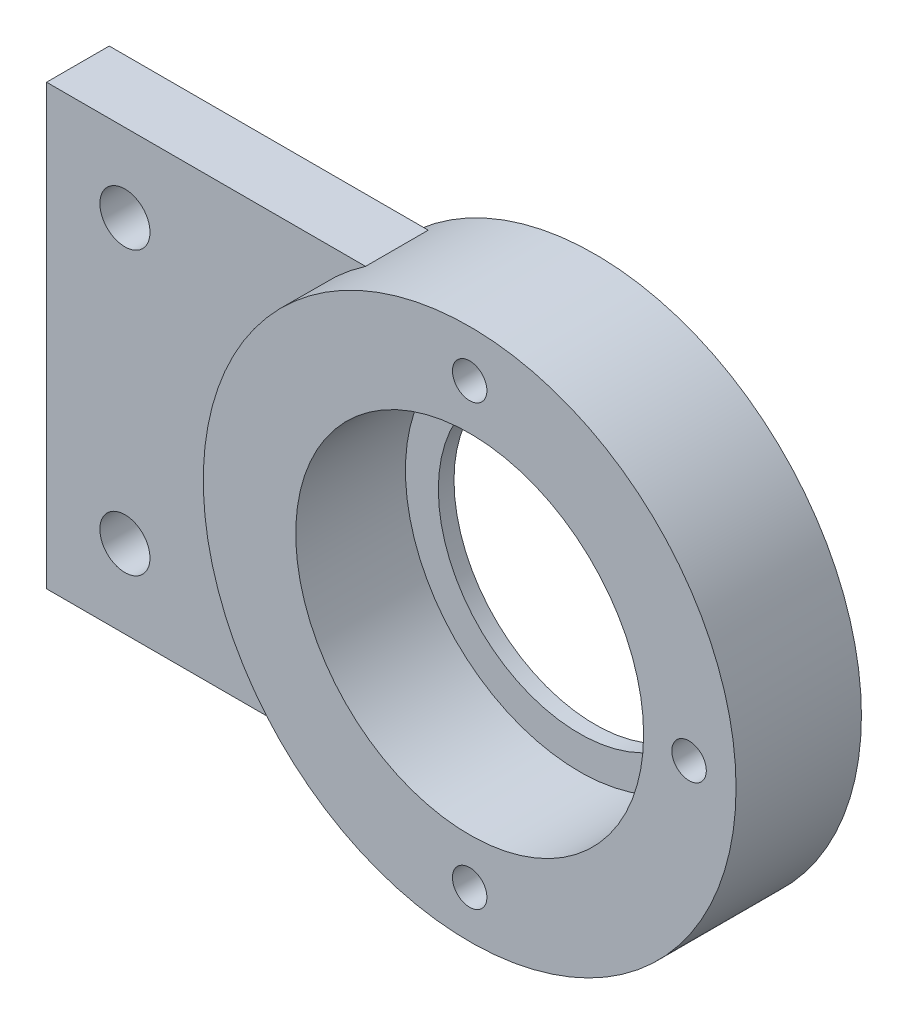
ISO-10303-21;
HEADER;
FILE_DESCRIPTION(('STEP AP214'),'2;1');
FILE_NAME('part.step','',(''),(''),'','','');
FILE_SCHEMA(('AUTOMOTIVE_DESIGN { 1 0 10303 214 1 1 1 1 }'));
ENDSEC;
DATA;
#1=APPLICATION_CONTEXT('core data for automotive mechanical design processes');
#2=APPLICATION_PROTOCOL_DEFINITION('international standard','automotive_design',2000,#1);
#3=PRODUCT_CONTEXT('',#1,'mechanical');
#4=PRODUCT('Part','Part','',(#3));
#5=PRODUCT_RELATED_PRODUCT_CATEGORY('part','',(#4));
#6=PRODUCT_DEFINITION_FORMATION('','',#4);
#7=PRODUCT_DEFINITION_CONTEXT('part definition',#1,'design');
#8=PRODUCT_DEFINITION('design','',#6,#7);
#9=PRODUCT_DEFINITION_SHAPE('','',#8);
#10=(LENGTH_UNIT() NAMED_UNIT(*) SI_UNIT(.MILLI.,.METRE.));
#11=(NAMED_UNIT(*) PLANE_ANGLE_UNIT() SI_UNIT($,.RADIAN.));
#12=(NAMED_UNIT(*) SI_UNIT($,.STERADIAN.) SOLID_ANGLE_UNIT());
#13=UNCERTAINTY_MEASURE_WITH_UNIT(LENGTH_MEASURE(1.E-05),#10,'distance_accuracy_value','');
#14=(GEOMETRIC_REPRESENTATION_CONTEXT(3) GLOBAL_UNCERTAINTY_ASSIGNED_CONTEXT((#13)) GLOBAL_UNIT_ASSIGNED_CONTEXT((#10,
#11,#12)) REPRESENTATION_CONTEXT('',''));
#15=CARTESIAN_POINT('',(0.,0.,0.));
#16=DIRECTION('',(0.,0.,1.));
#17=DIRECTION('',(1.,0.,0.));
#18=AXIS2_PLACEMENT_3D('',#15,#16,#17);
#19=CARTESIAN_POINT('',(0.,0.,0.));
#20=DIRECTION('',(0.,0.,1.));
#21=DIRECTION('',(1.,0.,0.));
#22=AXIS2_PLACEMENT_3D('',#19,#20,#21);
#23=PLANE('',#22);
#24=CARTESIAN_POINT('',(-25.,-9.,0.));
#25=DIRECTION('',(0.,0.,1.));
#26=DIRECTION('',(1.,0.,0.));
#27=AXIS2_PLACEMENT_3D('',#24,#25,#26);
#28=CIRCLE('',#27,1.6);
#29=CARTESIAN_POINT('',(-26.6,-9.,0.));
#30=VERTEX_POINT('',#29);
#31=EDGE_CURVE('E141',#30,#30,#28,.F.);
#32=ORIENTED_EDGE('',*,*,#31,.F.);
#33=EDGE_LOOP('',(#32));
#34=FACE_BOUND('',#33,.T.);
#35=CARTESIAN_POINT('',(-25.,9.,0.));
#36=DIRECTION('',(0.,0.,1.));
#37=DIRECTION('',(1.,0.,0.));
#38=AXIS2_PLACEMENT_3D('',#35,#36,#37);
#39=CIRCLE('',#38,1.6);
#40=CARTESIAN_POINT('',(-26.6,9.,0.));
#41=VERTEX_POINT('',#40);
#42=EDGE_CURVE('E140',#41,#41,#39,.F.);
#43=ORIENTED_EDGE('',*,*,#42,.F.);
#44=EDGE_LOOP('',(#43));
#45=FACE_BOUND('',#44,.T.);
#46=DIRECTION('',(-1.,0.,0.));
#47=VECTOR('',#46,1.);
#48=CARTESIAN_POINT('',(-30.,14.,0.));
#49=LINE('',#48,#47);
#50=CARTESIAN_POINT('',(-9.64365076099296,14.,0.));
#51=VERTEX_POINT('',#50);
#52=CARTESIAN_POINT('',(-30.,14.,0.));
#53=VERTEX_POINT('',#52);
#54=EDGE_CURVE('E89',#51,#53,#49,.T.);
#55=ORIENTED_EDGE('',*,*,#54,.F.);
#56=CARTESIAN_POINT('',(0.,0.,0.));
#57=DIRECTION('',(0.,0.,1.));
#58=DIRECTION('',(1.,0.,0.));
#59=AXIS2_PLACEMENT_3D('',#56,#57,#58);
#60=CIRCLE('',#59,17.);
#61=CARTESIAN_POINT('',(-9.64365076099296,-14.,0.));
#62=VERTEX_POINT('',#61);
#63=EDGE_CURVE('E66',#51,#62,#60,.T.);
#64=ORIENTED_EDGE('',*,*,#63,.T.);
#65=DIRECTION('',(1.,0.,0.));
#66=VECTOR('',#65,1.);
#67=CARTESIAN_POINT('',(-30.,-14.,0.));
#68=LINE('',#67,#66);
#69=CARTESIAN_POINT('',(-30.,-14.,0.));
#70=VERTEX_POINT('',#69);
#71=EDGE_CURVE('E86',#70,#62,#68,.T.);
#72=ORIENTED_EDGE('',*,*,#71,.F.);
#73=DIRECTION('',(0.,-1.,0.));
#74=VECTOR('',#73,1.);
#75=CARTESIAN_POINT('',(-30.,-14.,0.));
#76=LINE('',#75,#74);
#77=EDGE_CURVE('E95',#53,#70,#76,.T.);
#78=ORIENTED_EDGE('',*,*,#77,.F.);
#79=EDGE_LOOP('',(#55,#64,#72,#78));
#80=FACE_BOUND('',#79,.T.);
#81=ADVANCED_FACE('F44',(#34,#45,#80),#23,.F.);
#82=CARTESIAN_POINT('',(0.,0.,7.));
#83=DIRECTION('',(0.,0.,-1.));
#84=DIRECTION('',(-1.,0.,0.));
#85=AXIS2_PLACEMENT_3D('',#82,#83,#84);
#86=CYLINDRICAL_SURFACE('',#85,17.);
#87=CARTESIAN_POINT('',(0.,0.,7.));
#88=DIRECTION('',(0.,0.,1.));
#89=DIRECTION('',(1.,0.,0.));
#90=AXIS2_PLACEMENT_3D('',#87,#88,#89);
#91=CIRCLE('',#90,17.);
#92=CARTESIAN_POINT('',(17.,0.,7.));
#93=VERTEX_POINT('',#92);
#94=EDGE_CURVE('E122',#93,#93,#91,.T.);
#95=ORIENTED_EDGE('',*,*,#94,.F.);
#96=EDGE_LOOP('',(#95));
#97=FACE_BOUND('',#96,.T.);
#98=DIRECTION('',(0.,0.,-1.));
#99=VECTOR('',#98,1.);
#100=CARTESIAN_POINT('',(-9.64365076099296,-14.,7.));
#101=LINE('',#100,#99);
#102=CARTESIAN_POINT('',(-9.64365076099296,-14.,4.));
#103=VERTEX_POINT('',#102);
#104=EDGE_CURVE('E11',#62,#103,#101,.F.);
#105=ORIENTED_EDGE('',*,*,#104,.F.);
#106=ORIENTED_EDGE('',*,*,#63,.F.);
#107=DIRECTION('',(0.,0.,-1.));
#108=VECTOR('',#107,1.);
#109=CARTESIAN_POINT('',(-9.64365076099296,14.,7.));
#110=LINE('',#109,#108);
#111=CARTESIAN_POINT('',(-9.64365076099296,14.,4.));
#112=VERTEX_POINT('',#111);
#113=EDGE_CURVE('E54',#112,#51,#110,.T.);
#114=ORIENTED_EDGE('',*,*,#113,.F.);
#115=CARTESIAN_POINT('',(0.,0.,4.));
#116=DIRECTION('',(0.,0.,-1.));
#117=DIRECTION('',(-1.,0.,0.));
#118=AXIS2_PLACEMENT_3D('',#115,#116,#117);
#119=CIRCLE('',#118,17.);
#120=EDGE_CURVE('E65',#103,#112,#119,.T.);
#121=ORIENTED_EDGE('',*,*,#120,.F.);
#122=EDGE_LOOP('',(#105,#106,#114,#121));
#123=FACE_BOUND('',#122,.T.);
#124=CARTESIAN_POINT('',(0.,0.,-1.));
#125=DIRECTION('',(0.,0.,1.));
#126=DIRECTION('',(1.,0.,0.));
#127=AXIS2_PLACEMENT_3D('',#124,#125,#126);
#128=CIRCLE('',#127,17.);
#129=CARTESIAN_POINT('',(17.,0.,-1.));
#130=VERTEX_POINT('',#129);
#131=EDGE_CURVE('E91',#130,#130,#128,.T.);
#132=ORIENTED_EDGE('',*,*,#131,.T.);
#133=EDGE_LOOP('',(#132));
#134=FACE_BOUND('',#133,.T.);
#135=ADVANCED_FACE('F50',(#97,#123,#134),#86,.T.);
#136=CARTESIAN_POINT('',(0.,0.,7.));
#137=DIRECTION('',(0.,0.,-1.));
#138=DIRECTION('',(-1.,0.,0.));
#139=AXIS2_PLACEMENT_3D('',#136,#137,#138);
#140=CYLINDRICAL_SURFACE('',#139,11.1);
#141=CARTESIAN_POINT('',(0.,0.,0.));
#142=DIRECTION('',(0.,0.,1.));
#143=DIRECTION('',(1.,0.,0.));
#144=AXIS2_PLACEMENT_3D('',#141,#142,#143);
#145=CIRCLE('',#144,11.1);
#146=CARTESIAN_POINT('',(11.1,0.,0.));
#147=VERTEX_POINT('',#146);
#148=EDGE_CURVE('E117',#147,#147,#145,.T.);
#149=ORIENTED_EDGE('',*,*,#148,.F.);
#150=EDGE_LOOP('',(#149));
#151=FACE_BOUND('',#150,.T.);
#152=CARTESIAN_POINT('',(0.,0.,7.));
#153=DIRECTION('',(0.,0.,1.));
#154=DIRECTION('',(1.,0.,0.));
#155=AXIS2_PLACEMENT_3D('',#152,#153,#154);
#156=CIRCLE('',#155,11.1);
#157=CARTESIAN_POINT('',(11.1,0.,7.));
#158=VERTEX_POINT('',#157);
#159=EDGE_CURVE('E124',#158,#158,#156,.T.);
#160=ORIENTED_EDGE('',*,*,#159,.T.);
#161=EDGE_LOOP('',(#160));
#162=FACE_BOUND('',#161,.T.);
#163=ADVANCED_FACE('F219',(#151,#162),#140,.F.);
#164=CARTESIAN_POINT('',(0.,0.,7.));
#165=DIRECTION('',(0.,0.,1.));
#166=DIRECTION('',(1.,0.,0.));
#167=AXIS2_PLACEMENT_3D('',#164,#165,#166);
#168=PLANE('',#167);
#169=CARTESIAN_POINT('',(14.,0.,7.));
#170=DIRECTION('',(0.,0.,1.));
#171=DIRECTION('',(1.,0.,0.));
#172=AXIS2_PLACEMENT_3D('',#169,#170,#171);
#173=CIRCLE('',#172,1.1);
#174=CARTESIAN_POINT('',(12.9,0.,7.));
#175=VERTEX_POINT('',#174);
#176=EDGE_CURVE('E146',#175,#175,#173,.T.);
#177=ORIENTED_EDGE('',*,*,#176,.F.);
#178=EDGE_LOOP('',(#177));
#179=FACE_BOUND('',#178,.T.);
#180=CARTESIAN_POINT('',(0.,-14.,7.));
#181=DIRECTION('',(0.,0.,1.));
#182=DIRECTION('',(1.,0.,0.));
#183=AXIS2_PLACEMENT_3D('',#180,#181,#182);
#184=CIRCLE('',#183,1.1);
#185=CARTESIAN_POINT('',(-1.1,-14.,7.));
#186=VERTEX_POINT('',#185);
#187=EDGE_CURVE('E328',#186,#186,#184,.T.);
#188=ORIENTED_EDGE('',*,*,#187,.F.);
#189=EDGE_LOOP('',(#188));
#190=FACE_BOUND('',#189,.T.);
#191=CARTESIAN_POINT('',(0.,14.,7.));
#192=DIRECTION('',(0.,0.,1.));
#193=DIRECTION('',(1.,0.,0.));
#194=AXIS2_PLACEMENT_3D('',#191,#192,#193);
#195=CIRCLE('',#194,1.1);
#196=CARTESIAN_POINT('',(-1.1,14.,7.));
#197=VERTEX_POINT('',#196);
#198=EDGE_CURVE('E334',#197,#197,#195,.T.);
#199=ORIENTED_EDGE('',*,*,#198,.F.);
#200=EDGE_LOOP('',(#199));
#201=FACE_BOUND('',#200,.T.);
#202=ORIENTED_EDGE('',*,*,#94,.T.);
#203=EDGE_LOOP('',(#202));
#204=FACE_BOUND('',#203,.T.);
#205=ORIENTED_EDGE('',*,*,#159,.F.);
#206=EDGE_LOOP('',(#205));
#207=FACE_BOUND('',#206,.T.);
#208=ADVANCED_FACE('F223',(#179,#190,#201,#204,#207),#168,.T.);
#209=CARTESIAN_POINT('',(-30.,-14.,4.));
#210=DIRECTION('',(0.,1.,0.));
#211=DIRECTION('',(0.,0.,1.));
#212=AXIS2_PLACEMENT_3D('',#209,#210,#211);
#213=PLANE('',#212);
#214=ORIENTED_EDGE('',*,*,#71,.T.);
#215=ORIENTED_EDGE('',*,*,#104,.T.);
#216=DIRECTION('',(1.,0.,0.));
#217=VECTOR('',#216,1.);
#218=CARTESIAN_POINT('',(-30.,-14.,4.));
#219=LINE('',#218,#217);
#220=CARTESIAN_POINT('',(-30.,-14.,4.));
#221=VERTEX_POINT('',#220);
#222=EDGE_CURVE('E187',#221,#103,#219,.T.);
#223=ORIENTED_EDGE('',*,*,#222,.F.);
#224=DIRECTION('',(0.,0.,-1.));
#225=VECTOR('',#224,1.);
#226=CARTESIAN_POINT('',(-30.,-14.,4.));
#227=LINE('',#226,#225);
#228=EDGE_CURVE('E99',#221,#70,#227,.T.);
#229=ORIENTED_EDGE('',*,*,#228,.T.);
#230=EDGE_LOOP('',(#214,#215,#223,#229));
#231=FACE_BOUND('',#230,.T.);
#232=ADVANCED_FACE('F98',(#231),#213,.F.);
#233=CARTESIAN_POINT('',(-30.,14.,4.));
#234=DIRECTION('',(0.,-1.,0.));
#235=DIRECTION('',(0.,0.,-1.));
#236=AXIS2_PLACEMENT_3D('',#233,#234,#235);
#237=PLANE('',#236);
#238=DIRECTION('',(-1.,0.,0.));
#239=VECTOR('',#238,1.);
#240=CARTESIAN_POINT('',(-30.,14.,4.));
#241=LINE('',#240,#239);
#242=CARTESIAN_POINT('',(-30.,14.,4.));
#243=VERTEX_POINT('',#242);
#244=EDGE_CURVE('E113',#112,#243,#241,.T.);
#245=ORIENTED_EDGE('',*,*,#244,.F.);
#246=ORIENTED_EDGE('',*,*,#113,.T.);
#247=ORIENTED_EDGE('',*,*,#54,.T.);
#248=DIRECTION('',(0.,0.,-1.));
#249=VECTOR('',#248,1.);
#250=CARTESIAN_POINT('',(-30.,14.,4.));
#251=LINE('',#250,#249);
#252=EDGE_CURVE('E112',#243,#53,#251,.T.);
#253=ORIENTED_EDGE('',*,*,#252,.F.);
#254=EDGE_LOOP('',(#245,#246,#247,#253));
#255=FACE_BOUND('',#254,.T.);
#256=ADVANCED_FACE('F200',(#255),#237,.F.);
#257=CARTESIAN_POINT('',(-30.,-14.,4.));
#258=DIRECTION('',(1.,0.,0.));
#259=DIRECTION('',(0.,0.,-1.));
#260=AXIS2_PLACEMENT_3D('',#257,#258,#259);
#261=PLANE('',#260);
#262=ORIENTED_EDGE('',*,*,#77,.T.);
#263=ORIENTED_EDGE('',*,*,#228,.F.);
#264=DIRECTION('',(0.,-1.,0.));
#265=VECTOR('',#264,1.);
#266=CARTESIAN_POINT('',(-30.,-14.,4.));
#267=LINE('',#266,#265);
#268=EDGE_CURVE('E106',#243,#221,#267,.T.);
#269=ORIENTED_EDGE('',*,*,#268,.F.);
#270=ORIENTED_EDGE('',*,*,#252,.T.);
#271=EDGE_LOOP('',(#262,#263,#269,#270));
#272=FACE_BOUND('',#271,.T.);
#273=ADVANCED_FACE('F203',(#272),#261,.F.);
#274=CARTESIAN_POINT('',(0.,0.,4.));
#275=DIRECTION('',(0.,0.,-1.));
#276=DIRECTION('',(-1.,0.,0.));
#277=AXIS2_PLACEMENT_3D('',#274,#275,#276);
#278=PLANE('',#277);
#279=CARTESIAN_POINT('',(-25.,-9.,4.));
#280=DIRECTION('',(0.,0.,-1.));
#281=DIRECTION('',(-1.,0.,0.));
#282=AXIS2_PLACEMENT_3D('',#279,#280,#281);
#283=CIRCLE('',#282,1.6);
#284=CARTESIAN_POINT('',(-26.6,-9.,4.));
#285=VERTEX_POINT('',#284);
#286=EDGE_CURVE('E138',#285,#285,#283,.F.);
#287=ORIENTED_EDGE('',*,*,#286,.F.);
#288=EDGE_LOOP('',(#287));
#289=FACE_BOUND('',#288,.T.);
#290=CARTESIAN_POINT('',(-25.,9.,4.));
#291=DIRECTION('',(0.,0.,-1.));
#292=DIRECTION('',(-1.,0.,0.));
#293=AXIS2_PLACEMENT_3D('',#290,#291,#292);
#294=CIRCLE('',#293,1.6);
#295=CARTESIAN_POINT('',(-26.6,9.,4.));
#296=VERTEX_POINT('',#295);
#297=EDGE_CURVE('E133',#296,#296,#294,.F.);
#298=ORIENTED_EDGE('',*,*,#297,.F.);
#299=EDGE_LOOP('',(#298));
#300=FACE_BOUND('',#299,.T.);
#301=ORIENTED_EDGE('',*,*,#222,.T.);
#302=ORIENTED_EDGE('',*,*,#120,.T.);
#303=ORIENTED_EDGE('',*,*,#244,.T.);
#304=ORIENTED_EDGE('',*,*,#268,.T.);
#305=EDGE_LOOP('',(#301,#302,#303,#304));
#306=FACE_BOUND('',#305,.T.);
#307=ADVANCED_FACE('F198',(#289,#300,#306),#278,.F.);
#308=CARTESIAN_POINT('',(0.,0.,0.));
#309=DIRECTION('',(0.,0.,1.));
#310=DIRECTION('',(1.,0.,0.));
#311=AXIS2_PLACEMENT_3D('',#308,#309,#310);
#312=PLANE('',#311);
#313=ORIENTED_EDGE('',*,*,#148,.T.);
#314=EDGE_LOOP('',(#313));
#315=FACE_BOUND('',#314,.T.);
#316=CARTESIAN_POINT('',(0.,0.,0.));
#317=DIRECTION('',(0.,0.,1.));
#318=DIRECTION('',(1.,0.,0.));
#319=AXIS2_PLACEMENT_3D('',#316,#317,#318);
#320=CIRCLE('',#319,9.);
#321=CARTESIAN_POINT('',(9.,0.,0.));
#322=VERTEX_POINT('',#321);
#323=EDGE_CURVE('E179',#322,#322,#320,.T.);
#324=ORIENTED_EDGE('',*,*,#323,.F.);
#325=EDGE_LOOP('',(#324));
#326=FACE_BOUND('',#325,.T.);
#327=ADVANCED_FACE('F162',(#315,#326),#312,.T.);
#328=CARTESIAN_POINT('',(0.,0.,-1.));
#329=DIRECTION('',(0.,0.,1.));
#330=DIRECTION('',(1.,0.,0.));
#331=AXIS2_PLACEMENT_3D('',#328,#329,#330);
#332=PLANE('',#331);
#333=CARTESIAN_POINT('',(14.,0.,-1.));
#334=DIRECTION('',(0.,0.,1.));
#335=DIRECTION('',(1.,0.,0.));
#336=AXIS2_PLACEMENT_3D('',#333,#334,#335);
#337=CIRCLE('',#336,1.1);
#338=CARTESIAN_POINT('',(12.9,0.,-1.));
#339=VERTEX_POINT('',#338);
#340=EDGE_CURVE('E47',#339,#339,#337,.F.);
#341=ORIENTED_EDGE('',*,*,#340,.F.);
#342=EDGE_LOOP('',(#341));
#343=FACE_BOUND('',#342,.T.);
#344=CARTESIAN_POINT('',(0.,-14.,-1.));
#345=DIRECTION('',(0.,0.,1.));
#346=DIRECTION('',(1.,0.,0.));
#347=AXIS2_PLACEMENT_3D('',#344,#345,#346);
#348=CIRCLE('',#347,1.1);
#349=CARTESIAN_POINT('',(-1.1,-14.,-1.));
#350=VERTEX_POINT('',#349);
#351=EDGE_CURVE('E150',#350,#350,#348,.F.);
#352=ORIENTED_EDGE('',*,*,#351,.F.);
#353=EDGE_LOOP('',(#352));
#354=FACE_BOUND('',#353,.T.);
#355=CARTESIAN_POINT('',(0.,14.,-1.));
#356=DIRECTION('',(0.,0.,1.));
#357=DIRECTION('',(1.,0.,0.));
#358=AXIS2_PLACEMENT_3D('',#355,#356,#357);
#359=CIRCLE('',#358,1.1);
#360=CARTESIAN_POINT('',(-1.1,14.,-1.));
#361=VERTEX_POINT('',#360);
#362=EDGE_CURVE('E145',#361,#361,#359,.F.);
#363=ORIENTED_EDGE('',*,*,#362,.F.);
#364=EDGE_LOOP('',(#363));
#365=FACE_BOUND('',#364,.T.);
#366=ORIENTED_EDGE('',*,*,#131,.F.);
#367=EDGE_LOOP('',(#366));
#368=FACE_BOUND('',#367,.T.);
#369=CARTESIAN_POINT('',(0.,0.,-1.));
#370=DIRECTION('',(0.,0.,1.));
#371=DIRECTION('',(1.,0.,0.));
#372=AXIS2_PLACEMENT_3D('',#369,#370,#371);
#373=CIRCLE('',#372,9.);
#374=CARTESIAN_POINT('',(9.,0.,-1.));
#375=VERTEX_POINT('',#374);
#376=EDGE_CURVE('E175',#375,#375,#373,.T.);
#377=ORIENTED_EDGE('',*,*,#376,.T.);
#378=EDGE_LOOP('',(#377));
#379=FACE_BOUND('',#378,.T.);
#380=ADVANCED_FACE('F157',(#343,#354,#365,#368,#379),#332,.F.);
#381=CARTESIAN_POINT('',(0.,0.,0.));
#382=DIRECTION('',(0.,0.,-1.));
#383=DIRECTION('',(-1.,0.,0.));
#384=AXIS2_PLACEMENT_3D('',#381,#382,#383);
#385=CYLINDRICAL_SURFACE('',#384,9.);
#386=ORIENTED_EDGE('',*,*,#323,.T.);
#387=EDGE_LOOP('',(#386));
#388=FACE_BOUND('',#387,.T.);
#389=ORIENTED_EDGE('',*,*,#376,.F.);
#390=EDGE_LOOP('',(#389));
#391=FACE_BOUND('',#390,.T.);
#392=ADVANCED_FACE('F165',(#388,#391),#385,.F.);
#393=CARTESIAN_POINT('',(-25.,9.,7.));
#394=DIRECTION('',(0.,0.,-1.));
#395=DIRECTION('',(-1.,0.,0.));
#396=AXIS2_PLACEMENT_3D('',#393,#394,#395);
#397=CYLINDRICAL_SURFACE('',#396,1.6);
#398=CARTESIAN_POINT('',(-26.6,9.,4.));
#399=CARTESIAN_POINT('',(-26.6,9.,3.95833333333333));
#400=CARTESIAN_POINT('',(-26.6,9.,3.91666666666667));
#401=CARTESIAN_POINT('',(-26.6,9.,3.83333333333333));
#402=CARTESIAN_POINT('',(-26.6,9.,3.79166666666667));
#403=CARTESIAN_POINT('',(-26.6,9.,3.70833333333333));
#404=CARTESIAN_POINT('',(-26.6,9.,3.66666666666667));
#405=CARTESIAN_POINT('',(-26.6,9.,3.58333333333333));
#406=CARTESIAN_POINT('',(-26.6,9.,3.54166666666667));
#407=CARTESIAN_POINT('',(-26.6,9.,3.45833333333333));
#408=CARTESIAN_POINT('',(-26.6,9.,3.41666666666667));
#409=CARTESIAN_POINT('',(-26.6,9.,3.33333333333333));
#410=CARTESIAN_POINT('',(-26.6,9.,3.29166666666667));
#411=CARTESIAN_POINT('',(-26.6,9.,3.20833333333333));
#412=CARTESIAN_POINT('',(-26.6,9.,3.16666666666667));
#413=CARTESIAN_POINT('',(-26.6,9.,3.08333333333333));
#414=CARTESIAN_POINT('',(-26.6,9.,3.04166666666667));
#415=CARTESIAN_POINT('',(-26.6,9.,2.95833333333333));
#416=CARTESIAN_POINT('',(-26.6,9.,2.91666666666667));
#417=CARTESIAN_POINT('',(-26.6,9.,2.83333333333333));
#418=CARTESIAN_POINT('',(-26.6,9.,2.79166666666667));
#419=CARTESIAN_POINT('',(-26.6,9.,2.70833333333333));
#420=CARTESIAN_POINT('',(-26.6,9.,2.66666666666667));
#421=CARTESIAN_POINT('',(-26.6,9.,2.58333333333333));
#422=CARTESIAN_POINT('',(-26.6,9.,2.54166666666667));
#423=CARTESIAN_POINT('',(-26.6,9.,2.45833333333333));
#424=CARTESIAN_POINT('',(-26.6,9.,2.41666666666667));
#425=CARTESIAN_POINT('',(-26.6,9.,2.33333333333333));
#426=CARTESIAN_POINT('',(-26.6,9.,2.29166666666667));
#427=CARTESIAN_POINT('',(-26.6,9.,2.20833333333333));
#428=CARTESIAN_POINT('',(-26.6,9.,2.16666666666667));
#429=CARTESIAN_POINT('',(-26.6,9.,2.08333333333333));
#430=CARTESIAN_POINT('',(-26.6,9.,2.04166666666667));
#431=CARTESIAN_POINT('',(-26.6,9.,1.95833333333333));
#432=CARTESIAN_POINT('',(-26.6,9.,1.91666666666667));
#433=CARTESIAN_POINT('',(-26.6,9.,1.83333333333333));
#434=CARTESIAN_POINT('',(-26.6,9.,1.79166666666667));
#435=CARTESIAN_POINT('',(-26.6,9.,1.70833333333333));
#436=CARTESIAN_POINT('',(-26.6,9.,1.66666666666667));
#437=CARTESIAN_POINT('',(-26.6,9.,1.58333333333333));
#438=CARTESIAN_POINT('',(-26.6,9.,1.54166666666667));
#439=CARTESIAN_POINT('',(-26.6,9.,1.45833333333333));
#440=CARTESIAN_POINT('',(-26.6,9.,1.41666666666667));
#441=CARTESIAN_POINT('',(-26.6,9.,1.33333333333333));
#442=CARTESIAN_POINT('',(-26.6,9.,1.29166666666667));
#443=CARTESIAN_POINT('',(-26.6,9.,1.20833333333333));
#444=CARTESIAN_POINT('',(-26.6,9.,1.16666666666667));
#445=CARTESIAN_POINT('',(-26.6,9.,1.08333333333333));
#446=CARTESIAN_POINT('',(-26.6,9.,1.04166666666667));
#447=CARTESIAN_POINT('',(-26.6,9.,0.958333333333333));
#448=CARTESIAN_POINT('',(-26.6,9.,0.916666666666667));
#449=CARTESIAN_POINT('',(-26.6,9.,0.833333333333333));
#450=CARTESIAN_POINT('',(-26.6,9.,0.791666666666667));
#451=CARTESIAN_POINT('',(-26.6,9.,0.708333333333333));
#452=CARTESIAN_POINT('',(-26.6,9.,0.666666666666666));
#453=CARTESIAN_POINT('',(-26.6,9.,0.583333333333333));
#454=CARTESIAN_POINT('',(-26.6,9.,0.541666666666666));
#455=CARTESIAN_POINT('',(-26.6,9.,0.458333333333333));
#456=CARTESIAN_POINT('',(-26.6,9.,0.416666666666666));
#457=CARTESIAN_POINT('',(-26.6,9.,0.333333333333333));
#458=CARTESIAN_POINT('',(-26.6,9.,0.291666666666666));
#459=CARTESIAN_POINT('',(-26.6,9.,0.208333333333333));
#460=CARTESIAN_POINT('',(-26.6,9.,0.166666666666666));
#461=CARTESIAN_POINT('',(-26.6,9.,0.0833333333333325));
#462=CARTESIAN_POINT('',(-26.6,9.,0.0416666666666658));
#463=CARTESIAN_POINT('',(-26.6,9.,0.));
#464=B_SPLINE_CURVE_WITH_KNOTS('',3,(#398,#399,#400,#401,#402,#403,#404,#405,#406,#407,#408,
#409,#410,#411,#412,#413,#414,#415,#416,#417,#418,#419,#420,#421,#422,#423,#424,#425,#426,#427,
#428,#429,#430,#431,#432,#433,#434,#435,#436,#437,#438,#439,#440,#441,#442,#443,#444,#445,#446,
#447,#448,#449,#450,#451,#452,#453,#454,#455,#456,#457,#458,#459,#460,#461,#462,#463),
.UNSPECIFIED.,.F.,.F.,(4,2,2,2,2,2,2,2,2,2,2,2,2,2,2,2,2,2,2,2,2,2,2,2,2,2,2,2,2,2,2,2,4),(0.,
0.125,0.25,0.375,0.5,0.625,0.75,0.875,1.,1.125,1.25,1.375,1.5,1.625,1.75,1.875,2.,2.125,2.25,
2.375,2.5,2.625,2.75,2.875,3.,3.125,3.25,3.375,3.5,3.625,3.75,3.875,4.),.UNSPECIFIED.);
#465=EDGE_CURVE('BSEAM244',#296,#41,#464,.T.);
#466=ORIENTED_EDGE('',*,*,#297,.T.);
#467=ORIENTED_EDGE('',*,*,#42,.T.);
#468=ORIENTED_EDGE('',*,*,#465,.T.);
#469=ORIENTED_EDGE('',*,*,#465,.F.);
#470=EDGE_LOOP('',(#466,#468,#467,#469));
#471=FACE_BOUND('',#470,.T.);
#472=ADVANCED_FACE('F244',(#471),#397,.F.);
#473=CARTESIAN_POINT('',(-25.,-9.,7.));
#474=DIRECTION('',(0.,0.,-1.));
#475=DIRECTION('',(-1.,0.,0.));
#476=AXIS2_PLACEMENT_3D('',#473,#474,#475);
#477=CYLINDRICAL_SURFACE('',#476,1.6);
#478=CARTESIAN_POINT('',(-26.6,-9.,4.));
#479=CARTESIAN_POINT('',(-26.6,-9.,3.95833333333333));
#480=CARTESIAN_POINT('',(-26.6,-9.,3.91666666666667));
#481=CARTESIAN_POINT('',(-26.6,-9.,3.83333333333333));
#482=CARTESIAN_POINT('',(-26.6,-9.,3.79166666666667));
#483=CARTESIAN_POINT('',(-26.6,-9.,3.70833333333333));
#484=CARTESIAN_POINT('',(-26.6,-9.,3.66666666666667));
#485=CARTESIAN_POINT('',(-26.6,-9.,3.58333333333333));
#486=CARTESIAN_POINT('',(-26.6,-9.,3.54166666666667));
#487=CARTESIAN_POINT('',(-26.6,-9.,3.45833333333333));
#488=CARTESIAN_POINT('',(-26.6,-9.,3.41666666666667));
#489=CARTESIAN_POINT('',(-26.6,-9.,3.33333333333333));
#490=CARTESIAN_POINT('',(-26.6,-9.,3.29166666666667));
#491=CARTESIAN_POINT('',(-26.6,-9.,3.20833333333333));
#492=CARTESIAN_POINT('',(-26.6,-9.,3.16666666666667));
#493=CARTESIAN_POINT('',(-26.6,-9.,3.08333333333333));
#494=CARTESIAN_POINT('',(-26.6,-9.,3.04166666666667));
#495=CARTESIAN_POINT('',(-26.6,-9.,2.95833333333333));
#496=CARTESIAN_POINT('',(-26.6,-9.,2.91666666666667));
#497=CARTESIAN_POINT('',(-26.6,-9.,2.83333333333333));
#498=CARTESIAN_POINT('',(-26.6,-9.,2.79166666666667));
#499=CARTESIAN_POINT('',(-26.6,-9.,2.70833333333333));
#500=CARTESIAN_POINT('',(-26.6,-9.,2.66666666666667));
#501=CARTESIAN_POINT('',(-26.6,-9.,2.58333333333333));
#502=CARTESIAN_POINT('',(-26.6,-9.,2.54166666666667));
#503=CARTESIAN_POINT('',(-26.6,-9.,2.45833333333333));
#504=CARTESIAN_POINT('',(-26.6,-9.,2.41666666666667));
#505=CARTESIAN_POINT('',(-26.6,-9.,2.33333333333333));
#506=CARTESIAN_POINT('',(-26.6,-9.,2.29166666666667));
#507=CARTESIAN_POINT('',(-26.6,-9.,2.20833333333333));
#508=CARTESIAN_POINT('',(-26.6,-9.,2.16666666666667));
#509=CARTESIAN_POINT('',(-26.6,-9.,2.08333333333333));
#510=CARTESIAN_POINT('',(-26.6,-9.,2.04166666666667));
#511=CARTESIAN_POINT('',(-26.6,-9.,1.95833333333333));
#512=CARTESIAN_POINT('',(-26.6,-9.,1.91666666666667));
#513=CARTESIAN_POINT('',(-26.6,-9.,1.83333333333333));
#514=CARTESIAN_POINT('',(-26.6,-9.,1.79166666666667));
#515=CARTESIAN_POINT('',(-26.6,-9.,1.70833333333333));
#516=CARTESIAN_POINT('',(-26.6,-9.,1.66666666666667));
#517=CARTESIAN_POINT('',(-26.6,-9.,1.58333333333333));
#518=CARTESIAN_POINT('',(-26.6,-9.,1.54166666666667));
#519=CARTESIAN_POINT('',(-26.6,-9.,1.45833333333333));
#520=CARTESIAN_POINT('',(-26.6,-9.,1.41666666666667));
#521=CARTESIAN_POINT('',(-26.6,-9.,1.33333333333333));
#522=CARTESIAN_POINT('',(-26.6,-9.,1.29166666666667));
#523=CARTESIAN_POINT('',(-26.6,-9.,1.20833333333333));
#524=CARTESIAN_POINT('',(-26.6,-9.,1.16666666666667));
#525=CARTESIAN_POINT('',(-26.6,-9.,1.08333333333333));
#526=CARTESIAN_POINT('',(-26.6,-9.,1.04166666666667));
#527=CARTESIAN_POINT('',(-26.6,-9.,0.958333333333333));
#528=CARTESIAN_POINT('',(-26.6,-9.,0.916666666666667));
#529=CARTESIAN_POINT('',(-26.6,-9.,0.833333333333333));
#530=CARTESIAN_POINT('',(-26.6,-9.,0.791666666666667));
#531=CARTESIAN_POINT('',(-26.6,-9.,0.708333333333333));
#532=CARTESIAN_POINT('',(-26.6,-9.,0.666666666666666));
#533=CARTESIAN_POINT('',(-26.6,-9.,0.583333333333333));
#534=CARTESIAN_POINT('',(-26.6,-9.,0.541666666666666));
#535=CARTESIAN_POINT('',(-26.6,-9.,0.458333333333333));
#536=CARTESIAN_POINT('',(-26.6,-9.,0.416666666666666));
#537=CARTESIAN_POINT('',(-26.6,-9.,0.333333333333333));
#538=CARTESIAN_POINT('',(-26.6,-9.,0.291666666666666));
#539=CARTESIAN_POINT('',(-26.6,-9.,0.208333333333333));
#540=CARTESIAN_POINT('',(-26.6,-9.,0.166666666666666));
#541=CARTESIAN_POINT('',(-26.6,-9.,0.0833333333333325));
#542=CARTESIAN_POINT('',(-26.6,-9.,0.0416666666666658));
#543=CARTESIAN_POINT('',(-26.6,-9.,0.));
#544=B_SPLINE_CURVE_WITH_KNOTS('',3,(#478,#479,#480,#481,#482,#483,#484,#485,#486,#487,#488,
#489,#490,#491,#492,#493,#494,#495,#496,#497,#498,#499,#500,#501,#502,#503,#504,#505,#506,#507,
#508,#509,#510,#511,#512,#513,#514,#515,#516,#517,#518,#519,#520,#521,#522,#523,#524,#525,#526,
#527,#528,#529,#530,#531,#532,#533,#534,#535,#536,#537,#538,#539,#540,#541,#542,#543),
.UNSPECIFIED.,.F.,.F.,(4,2,2,2,2,2,2,2,2,2,2,2,2,2,2,2,2,2,2,2,2,2,2,2,2,2,2,2,2,2,2,2,4),(0.,
0.125,0.25,0.375,0.5,0.625,0.75,0.875,1.,1.125,1.25,1.375,1.5,1.625,1.75,1.875,2.,2.125,2.25,
2.375,2.5,2.625,2.75,2.875,3.,3.125,3.25,3.375,3.5,3.625,3.75,3.875,4.),.UNSPECIFIED.);
#545=EDGE_CURVE('BSEAM249',#285,#30,#544,.T.);
#546=ORIENTED_EDGE('',*,*,#286,.T.);
#547=ORIENTED_EDGE('',*,*,#31,.T.);
#548=ORIENTED_EDGE('',*,*,#545,.T.);
#549=ORIENTED_EDGE('',*,*,#545,.F.);
#550=EDGE_LOOP('',(#546,#548,#547,#549));
#551=FACE_BOUND('',#550,.T.);
#552=ADVANCED_FACE('F249',(#551),#477,.F.);
#553=CARTESIAN_POINT('',(0.,14.,7.));
#554=DIRECTION('',(0.,0.,-1.));
#555=DIRECTION('',(-1.,0.,0.));
#556=AXIS2_PLACEMENT_3D('',#553,#554,#555);
#557=CYLINDRICAL_SURFACE('',#556,1.1);
#558=CARTESIAN_POINT('',(-1.1,14.,7.));
#559=CARTESIAN_POINT('',(-1.1,14.,6.91666666666667));
#560=CARTESIAN_POINT('',(-1.1,14.,6.83333333333333));
#561=CARTESIAN_POINT('',(-1.1,14.,6.66666666666667));
#562=CARTESIAN_POINT('',(-1.1,14.,6.58333333333333));
#563=CARTESIAN_POINT('',(-1.1,14.,6.41666666666667));
#564=CARTESIAN_POINT('',(-1.1,14.,6.33333333333333));
#565=CARTESIAN_POINT('',(-1.1,14.,6.16666666666667));
#566=CARTESIAN_POINT('',(-1.1,14.,6.08333333333333));
#567=CARTESIAN_POINT('',(-1.1,14.,5.91666666666666));
#568=CARTESIAN_POINT('',(-1.1,14.,5.83333333333333));
#569=CARTESIAN_POINT('',(-1.1,14.,5.66666666666666));
#570=CARTESIAN_POINT('',(-1.1,14.,5.58333333333333));
#571=CARTESIAN_POINT('',(-1.1,14.,5.41666666666667));
#572=CARTESIAN_POINT('',(-1.1,14.,5.33333333333333));
#573=CARTESIAN_POINT('',(-1.1,14.,5.16666666666667));
#574=CARTESIAN_POINT('',(-1.1,14.,5.08333333333333));
#575=CARTESIAN_POINT('',(-1.1,14.,4.91666666666666));
#576=CARTESIAN_POINT('',(-1.1,14.,4.83333333333333));
#577=CARTESIAN_POINT('',(-1.1,14.,4.66666666666666));
#578=CARTESIAN_POINT('',(-1.1,14.,4.58333333333333));
#579=CARTESIAN_POINT('',(-1.1,14.,4.41666666666667));
#580=CARTESIAN_POINT('',(-1.1,14.,4.33333333333333));
#581=CARTESIAN_POINT('',(-1.1,14.,4.16666666666667));
#582=CARTESIAN_POINT('',(-1.1,14.,4.08333333333333));
#583=CARTESIAN_POINT('',(-1.1,14.,3.91666666666666));
#584=CARTESIAN_POINT('',(-1.1,14.,3.83333333333333));
#585=CARTESIAN_POINT('',(-1.1,14.,3.66666666666666));
#586=CARTESIAN_POINT('',(-1.1,14.,3.58333333333333));
#587=CARTESIAN_POINT('',(-1.1,14.,3.41666666666666));
#588=CARTESIAN_POINT('',(-1.1,14.,3.33333333333333));
#589=CARTESIAN_POINT('',(-1.1,14.,3.16666666666666));
#590=CARTESIAN_POINT('',(-1.1,14.,3.08333333333333));
#591=CARTESIAN_POINT('',(-1.1,14.,2.91666666666667));
#592=CARTESIAN_POINT('',(-1.1,14.,2.83333333333333));
#593=CARTESIAN_POINT('',(-1.1,14.,2.66666666666666));
#594=CARTESIAN_POINT('',(-1.1,14.,2.58333333333333));
#595=CARTESIAN_POINT('',(-1.1,14.,2.41666666666666));
#596=CARTESIAN_POINT('',(-1.1,14.,2.33333333333333));
#597=CARTESIAN_POINT('',(-1.1,14.,2.16666666666666));
#598=CARTESIAN_POINT('',(-1.1,14.,2.08333333333333));
#599=CARTESIAN_POINT('',(-1.1,14.,1.91666666666666));
#600=CARTESIAN_POINT('',(-1.1,14.,1.83333333333333));
#601=CARTESIAN_POINT('',(-1.1,14.,1.66666666666666));
#602=CARTESIAN_POINT('',(-1.1,14.,1.58333333333333));
#603=CARTESIAN_POINT('',(-1.1,14.,1.41666666666666));
#604=CARTESIAN_POINT('',(-1.1,14.,1.33333333333333));
#605=CARTESIAN_POINT('',(-1.1,14.,1.16666666666666));
#606=CARTESIAN_POINT('',(-1.1,14.,1.08333333333333));
#607=CARTESIAN_POINT('',(-1.1,14.,0.916666666666664));
#608=CARTESIAN_POINT('',(-1.1,14.,0.833333333333331));
#609=CARTESIAN_POINT('',(-1.1,14.,0.666666666666664));
#610=CARTESIAN_POINT('',(-1.1,14.,0.58333333333333));
#611=CARTESIAN_POINT('',(-1.1,14.,0.416666666666664));
#612=CARTESIAN_POINT('',(-1.1,14.,0.33333333333333));
#613=CARTESIAN_POINT('',(-1.1,14.,0.166666666666664));
#614=CARTESIAN_POINT('',(-1.1,14.,0.0833333333333305));
#615=CARTESIAN_POINT('',(-1.1,14.,-0.083333333333336));
#616=CARTESIAN_POINT('',(-1.1,14.,-0.166666666666669));
#617=CARTESIAN_POINT('',(-1.1,14.,-0.333333333333336));
#618=CARTESIAN_POINT('',(-1.1,14.,-0.41666666666667));
#619=CARTESIAN_POINT('',(-1.1,14.,-0.583333333333336));
#620=CARTESIAN_POINT('',(-1.1,14.,-0.66666666666667));
#621=CARTESIAN_POINT('',(-1.1,14.,-0.833333333333336));
#622=CARTESIAN_POINT('',(-1.1,14.,-0.91666666666667));
#623=CARTESIAN_POINT('',(-1.1,14.,-1.));
#624=B_SPLINE_CURVE_WITH_KNOTS('',3,(#558,#559,#560,#561,#562,#563,#564,#565,#566,#567,#568,
#569,#570,#571,#572,#573,#574,#575,#576,#577,#578,#579,#580,#581,#582,#583,#584,#585,#586,#587,
#588,#589,#590,#591,#592,#593,#594,#595,#596,#597,#598,#599,#600,#601,#602,#603,#604,#605,#606,
#607,#608,#609,#610,#611,#612,#613,#614,#615,#616,#617,#618,#619,#620,#621,#622,#623),
.UNSPECIFIED.,.F.,.F.,(4,2,2,2,2,2,2,2,2,2,2,2,2,2,2,2,2,2,2,2,2,2,2,2,2,2,2,2,2,2,2,2,4),(0.,
0.25,0.5,0.750000000000001,1.,1.25,1.5,1.75,2.,2.25,2.5,2.75,3.,3.25,3.5,3.75,4.,4.25,4.5,4.75,
5.,5.25,5.5,5.75,6.,6.25,6.5,6.75,7.,7.25,7.5,7.75,8.),.UNSPECIFIED.);
#625=EDGE_CURVE('BSEAM299',#197,#361,#624,.T.);
#626=ORIENTED_EDGE('',*,*,#198,.T.);
#627=ORIENTED_EDGE('',*,*,#362,.T.);
#628=ORIENTED_EDGE('',*,*,#625,.T.);
#629=ORIENTED_EDGE('',*,*,#625,.F.);
#630=EDGE_LOOP('',(#626,#628,#627,#629));
#631=FACE_BOUND('',#630,.T.);
#632=ADVANCED_FACE('F299',(#631),#557,.F.);
#633=CARTESIAN_POINT('',(0.,-14.,7.));
#634=DIRECTION('',(0.,0.,-1.));
#635=DIRECTION('',(-1.,0.,0.));
#636=AXIS2_PLACEMENT_3D('',#633,#634,#635);
#637=CYLINDRICAL_SURFACE('',#636,1.1);
#638=CARTESIAN_POINT('',(-1.1,-14.,7.));
#639=CARTESIAN_POINT('',(-1.1,-14.,6.91666666666667));
#640=CARTESIAN_POINT('',(-1.1,-14.,6.83333333333333));
#641=CARTESIAN_POINT('',(-1.1,-14.,6.66666666666667));
#642=CARTESIAN_POINT('',(-1.1,-14.,6.58333333333333));
#643=CARTESIAN_POINT('',(-1.1,-14.,6.41666666666667));
#644=CARTESIAN_POINT('',(-1.1,-14.,6.33333333333333));
#645=CARTESIAN_POINT('',(-1.1,-14.,6.16666666666667));
#646=CARTESIAN_POINT('',(-1.1,-14.,6.08333333333333));
#647=CARTESIAN_POINT('',(-1.1,-14.,5.91666666666666));
#648=CARTESIAN_POINT('',(-1.1,-14.,5.83333333333333));
#649=CARTESIAN_POINT('',(-1.1,-14.,5.66666666666666));
#650=CARTESIAN_POINT('',(-1.1,-14.,5.58333333333333));
#651=CARTESIAN_POINT('',(-1.1,-14.,5.41666666666667));
#652=CARTESIAN_POINT('',(-1.1,-14.,5.33333333333333));
#653=CARTESIAN_POINT('',(-1.1,-14.,5.16666666666667));
#654=CARTESIAN_POINT('',(-1.1,-14.,5.08333333333333));
#655=CARTESIAN_POINT('',(-1.1,-14.,4.91666666666666));
#656=CARTESIAN_POINT('',(-1.1,-14.,4.83333333333333));
#657=CARTESIAN_POINT('',(-1.1,-14.,4.66666666666666));
#658=CARTESIAN_POINT('',(-1.1,-14.,4.58333333333333));
#659=CARTESIAN_POINT('',(-1.1,-14.,4.41666666666667));
#660=CARTESIAN_POINT('',(-1.1,-14.,4.33333333333333));
#661=CARTESIAN_POINT('',(-1.1,-14.,4.16666666666667));
#662=CARTESIAN_POINT('',(-1.1,-14.,4.08333333333333));
#663=CARTESIAN_POINT('',(-1.1,-14.,3.91666666666666));
#664=CARTESIAN_POINT('',(-1.1,-14.,3.83333333333333));
#665=CARTESIAN_POINT('',(-1.1,-14.,3.66666666666666));
#666=CARTESIAN_POINT('',(-1.1,-14.,3.58333333333333));
#667=CARTESIAN_POINT('',(-1.1,-14.,3.41666666666666));
#668=CARTESIAN_POINT('',(-1.1,-14.,3.33333333333333));
#669=CARTESIAN_POINT('',(-1.1,-14.,3.16666666666666));
#670=CARTESIAN_POINT('',(-1.1,-14.,3.08333333333333));
#671=CARTESIAN_POINT('',(-1.1,-14.,2.91666666666667));
#672=CARTESIAN_POINT('',(-1.1,-14.,2.83333333333333));
#673=CARTESIAN_POINT('',(-1.1,-14.,2.66666666666666));
#674=CARTESIAN_POINT('',(-1.1,-14.,2.58333333333333));
#675=CARTESIAN_POINT('',(-1.1,-14.,2.41666666666666));
#676=CARTESIAN_POINT('',(-1.1,-14.,2.33333333333333));
#677=CARTESIAN_POINT('',(-1.1,-14.,2.16666666666666));
#678=CARTESIAN_POINT('',(-1.1,-14.,2.08333333333333));
#679=CARTESIAN_POINT('',(-1.1,-14.,1.91666666666666));
#680=CARTESIAN_POINT('',(-1.1,-14.,1.83333333333333));
#681=CARTESIAN_POINT('',(-1.1,-14.,1.66666666666666));
#682=CARTESIAN_POINT('',(-1.1,-14.,1.58333333333333));
#683=CARTESIAN_POINT('',(-1.1,-14.,1.41666666666666));
#684=CARTESIAN_POINT('',(-1.1,-14.,1.33333333333333));
#685=CARTESIAN_POINT('',(-1.1,-14.,1.16666666666666));
#686=CARTESIAN_POINT('',(-1.1,-14.,1.08333333333333));
#687=CARTESIAN_POINT('',(-1.1,-14.,0.916666666666664));
#688=CARTESIAN_POINT('',(-1.1,-14.,0.833333333333331));
#689=CARTESIAN_POINT('',(-1.1,-14.,0.666666666666664));
#690=CARTESIAN_POINT('',(-1.1,-14.,0.58333333333333));
#691=CARTESIAN_POINT('',(-1.1,-14.,0.416666666666664));
#692=CARTESIAN_POINT('',(-1.1,-14.,0.33333333333333));
#693=CARTESIAN_POINT('',(-1.1,-14.,0.166666666666664));
#694=CARTESIAN_POINT('',(-1.1,-14.,0.0833333333333305));
#695=CARTESIAN_POINT('',(-1.1,-14.,-0.083333333333336));
#696=CARTESIAN_POINT('',(-1.1,-14.,-0.166666666666669));
#697=CARTESIAN_POINT('',(-1.1,-14.,-0.333333333333336));
#698=CARTESIAN_POINT('',(-1.1,-14.,-0.41666666666667));
#699=CARTESIAN_POINT('',(-1.1,-14.,-0.583333333333336));
#700=CARTESIAN_POINT('',(-1.1,-14.,-0.66666666666667));
#701=CARTESIAN_POINT('',(-1.1,-14.,-0.833333333333336));
#702=CARTESIAN_POINT('',(-1.1,-14.,-0.91666666666667));
#703=CARTESIAN_POINT('',(-1.1,-14.,-1.));
#704=B_SPLINE_CURVE_WITH_KNOTS('',3,(#638,#639,#640,#641,#642,#643,#644,#645,#646,#647,#648,
#649,#650,#651,#652,#653,#654,#655,#656,#657,#658,#659,#660,#661,#662,#663,#664,#665,#666,#667,
#668,#669,#670,#671,#672,#673,#674,#675,#676,#677,#678,#679,#680,#681,#682,#683,#684,#685,#686,
#687,#688,#689,#690,#691,#692,#693,#694,#695,#696,#697,#698,#699,#700,#701,#702,#703),
.UNSPECIFIED.,.F.,.F.,(4,2,2,2,2,2,2,2,2,2,2,2,2,2,2,2,2,2,2,2,2,2,2,2,2,2,2,2,2,2,2,2,4),(0.,
0.25,0.5,0.750000000000001,1.,1.25,1.5,1.75,2.,2.25,2.5,2.75,3.,3.25,3.5,3.75,4.,4.25,4.5,4.75,
5.,5.25,5.5,5.75,6.,6.25,6.5,6.75,7.,7.25,7.5,7.75,8.),.UNSPECIFIED.);
#705=EDGE_CURVE('BSEAM303',#186,#350,#704,.T.);
#706=ORIENTED_EDGE('',*,*,#187,.T.);
#707=ORIENTED_EDGE('',*,*,#351,.T.);
#708=ORIENTED_EDGE('',*,*,#705,.T.);
#709=ORIENTED_EDGE('',*,*,#705,.F.);
#710=EDGE_LOOP('',(#706,#708,#707,#709));
#711=FACE_BOUND('',#710,.T.);
#712=ADVANCED_FACE('F303',(#711),#637,.F.);
#713=CARTESIAN_POINT('',(14.,0.,7.));
#714=DIRECTION('',(0.,0.,-1.));
#715=DIRECTION('',(-1.,0.,0.));
#716=AXIS2_PLACEMENT_3D('',#713,#714,#715);
#717=CYLINDRICAL_SURFACE('',#716,1.1);
#718=CARTESIAN_POINT('',(12.9,0.,7.));
#719=CARTESIAN_POINT('',(12.9,0.,6.91666666666667));
#720=CARTESIAN_POINT('',(12.9,0.,6.83333333333333));
#721=CARTESIAN_POINT('',(12.9,0.,6.66666666666667));
#722=CARTESIAN_POINT('',(12.9,0.,6.58333333333333));
#723=CARTESIAN_POINT('',(12.9,0.,6.41666666666667));
#724=CARTESIAN_POINT('',(12.9,0.,6.33333333333333));
#725=CARTESIAN_POINT('',(12.9,0.,6.16666666666667));
#726=CARTESIAN_POINT('',(12.9,0.,6.08333333333333));
#727=CARTESIAN_POINT('',(12.9,0.,5.91666666666666));
#728=CARTESIAN_POINT('',(12.9,0.,5.83333333333333));
#729=CARTESIAN_POINT('',(12.9,0.,5.66666666666666));
#730=CARTESIAN_POINT('',(12.9,0.,5.58333333333333));
#731=CARTESIAN_POINT('',(12.9,0.,5.41666666666667));
#732=CARTESIAN_POINT('',(12.9,0.,5.33333333333333));
#733=CARTESIAN_POINT('',(12.9,0.,5.16666666666667));
#734=CARTESIAN_POINT('',(12.9,0.,5.08333333333333));
#735=CARTESIAN_POINT('',(12.9,0.,4.91666666666666));
#736=CARTESIAN_POINT('',(12.9,0.,4.83333333333333));
#737=CARTESIAN_POINT('',(12.9,0.,4.66666666666666));
#738=CARTESIAN_POINT('',(12.9,0.,4.58333333333333));
#739=CARTESIAN_POINT('',(12.9,0.,4.41666666666667));
#740=CARTESIAN_POINT('',(12.9,0.,4.33333333333333));
#741=CARTESIAN_POINT('',(12.9,0.,4.16666666666667));
#742=CARTESIAN_POINT('',(12.9,0.,4.08333333333333));
#743=CARTESIAN_POINT('',(12.9,0.,3.91666666666666));
#744=CARTESIAN_POINT('',(12.9,0.,3.83333333333333));
#745=CARTESIAN_POINT('',(12.9,0.,3.66666666666666));
#746=CARTESIAN_POINT('',(12.9,0.,3.58333333333333));
#747=CARTESIAN_POINT('',(12.9,0.,3.41666666666666));
#748=CARTESIAN_POINT('',(12.9,0.,3.33333333333333));
#749=CARTESIAN_POINT('',(12.9,0.,3.16666666666666));
#750=CARTESIAN_POINT('',(12.9,0.,3.08333333333333));
#751=CARTESIAN_POINT('',(12.9,0.,2.91666666666667));
#752=CARTESIAN_POINT('',(12.9,0.,2.83333333333333));
#753=CARTESIAN_POINT('',(12.9,0.,2.66666666666666));
#754=CARTESIAN_POINT('',(12.9,0.,2.58333333333333));
#755=CARTESIAN_POINT('',(12.9,0.,2.41666666666666));
#756=CARTESIAN_POINT('',(12.9,0.,2.33333333333333));
#757=CARTESIAN_POINT('',(12.9,0.,2.16666666666666));
#758=CARTESIAN_POINT('',(12.9,0.,2.08333333333333));
#759=CARTESIAN_POINT('',(12.9,0.,1.91666666666666));
#760=CARTESIAN_POINT('',(12.9,0.,1.83333333333333));
#761=CARTESIAN_POINT('',(12.9,0.,1.66666666666666));
#762=CARTESIAN_POINT('',(12.9,0.,1.58333333333333));
#763=CARTESIAN_POINT('',(12.9,0.,1.41666666666666));
#764=CARTESIAN_POINT('',(12.9,0.,1.33333333333333));
#765=CARTESIAN_POINT('',(12.9,0.,1.16666666666666));
#766=CARTESIAN_POINT('',(12.9,0.,1.08333333333333));
#767=CARTESIAN_POINT('',(12.9,0.,0.916666666666664));
#768=CARTESIAN_POINT('',(12.9,0.,0.833333333333331));
#769=CARTESIAN_POINT('',(12.9,0.,0.666666666666664));
#770=CARTESIAN_POINT('',(12.9,0.,0.58333333333333));
#771=CARTESIAN_POINT('',(12.9,0.,0.416666666666664));
#772=CARTESIAN_POINT('',(12.9,0.,0.33333333333333));
#773=CARTESIAN_POINT('',(12.9,0.,0.166666666666664));
#774=CARTESIAN_POINT('',(12.9,0.,0.0833333333333305));
#775=CARTESIAN_POINT('',(12.9,0.,-0.083333333333336));
#776=CARTESIAN_POINT('',(12.9,0.,-0.166666666666669));
#777=CARTESIAN_POINT('',(12.9,0.,-0.333333333333336));
#778=CARTESIAN_POINT('',(12.9,0.,-0.41666666666667));
#779=CARTESIAN_POINT('',(12.9,0.,-0.583333333333336));
#780=CARTESIAN_POINT('',(12.9,0.,-0.66666666666667));
#781=CARTESIAN_POINT('',(12.9,0.,-0.833333333333336));
#782=CARTESIAN_POINT('',(12.9,0.,-0.91666666666667));
#783=CARTESIAN_POINT('',(12.9,0.,-1.));
#784=B_SPLINE_CURVE_WITH_KNOTS('',3,(#718,#719,#720,#721,#722,#723,#724,#725,#726,#727,#728,
#729,#730,#731,#732,#733,#734,#735,#736,#737,#738,#739,#740,#741,#742,#743,#744,#745,#746,#747,
#748,#749,#750,#751,#752,#753,#754,#755,#756,#757,#758,#759,#760,#761,#762,#763,#764,#765,#766,
#767,#768,#769,#770,#771,#772,#773,#774,#775,#776,#777,#778,#779,#780,#781,#782,#783),
.UNSPECIFIED.,.F.,.F.,(4,2,2,2,2,2,2,2,2,2,2,2,2,2,2,2,2,2,2,2,2,2,2,2,2,2,2,2,2,2,2,2,4),(0.,
0.25,0.5,0.750000000000001,1.,1.25,1.5,1.75,2.,2.25,2.5,2.75,3.,3.25,3.5,3.75,4.,4.25,4.5,4.75,
5.,5.25,5.5,5.75,6.,6.25,6.5,6.75,7.,7.25,7.5,7.75,8.),.UNSPECIFIED.);
#785=EDGE_CURVE('BSEAM160',#175,#339,#784,.T.);
#786=ORIENTED_EDGE('',*,*,#176,.T.);
#787=ORIENTED_EDGE('',*,*,#340,.T.);
#788=ORIENTED_EDGE('',*,*,#785,.T.);
#789=ORIENTED_EDGE('',*,*,#785,.F.);
#790=EDGE_LOOP('',(#786,#788,#787,#789));
#791=FACE_BOUND('',#790,.T.);
#792=ADVANCED_FACE('F160',(#791),#717,.F.);
#793=CLOSED_SHELL('',(#81,#135,#163,#208,#232,#256,#273,#307,#327,#380,#392,#472,#552,#632,#712,#792));
#794=MANIFOLD_SOLID_BREP('B2',#793);
#795=ADVANCED_BREP_SHAPE_REPRESENTATION('',(#18,#794),#14);
#796=SHAPE_DEFINITION_REPRESENTATION(#9,#795);
ENDSEC;
END-ISO-10303-21;
